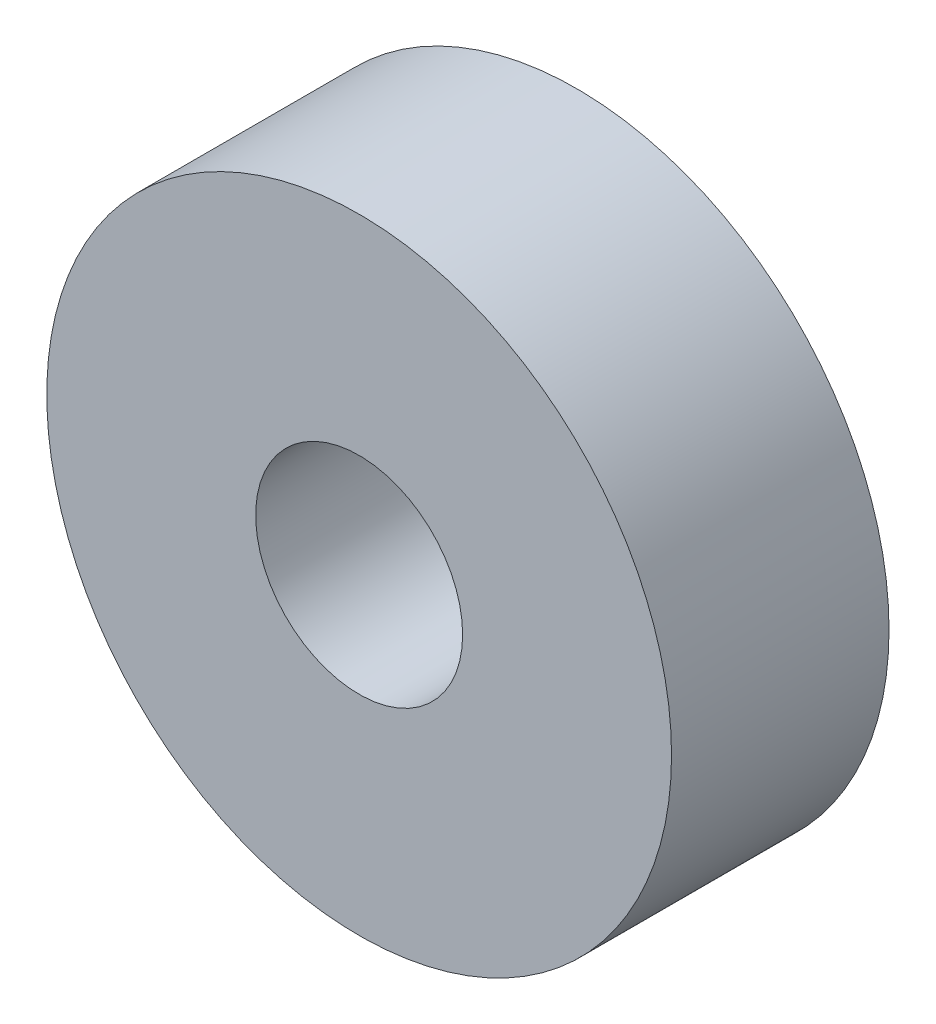
ISO-10303-21;
HEADER;
FILE_DESCRIPTION(('STEP AP214'),'2;1');
FILE_NAME('part.step','',(''),(''),'','','');
FILE_SCHEMA(('AUTOMOTIVE_DESIGN { 1 0 10303 214 1 1 1 1 }'));
ENDSEC;
DATA;
#1=APPLICATION_CONTEXT('core data for automotive mechanical design processes');
#2=APPLICATION_PROTOCOL_DEFINITION('international standard','automotive_design',2000,#1);
#3=PRODUCT_CONTEXT('',#1,'mechanical');
#4=PRODUCT('Part','Part','',(#3));
#5=PRODUCT_RELATED_PRODUCT_CATEGORY('part','',(#4));
#6=PRODUCT_DEFINITION_FORMATION('','',#4);
#7=PRODUCT_DEFINITION_CONTEXT('part definition',#1,'design');
#8=PRODUCT_DEFINITION('design','',#6,#7);
#9=PRODUCT_DEFINITION_SHAPE('','',#8);
#10=(LENGTH_UNIT() NAMED_UNIT(*) SI_UNIT(.MILLI.,.METRE.));
#11=(NAMED_UNIT(*) PLANE_ANGLE_UNIT() SI_UNIT($,.RADIAN.));
#12=(NAMED_UNIT(*) SI_UNIT($,.STERADIAN.) SOLID_ANGLE_UNIT());
#13=UNCERTAINTY_MEASURE_WITH_UNIT(LENGTH_MEASURE(1.E-05),#10,'distance_accuracy_value','');
#14=(GEOMETRIC_REPRESENTATION_CONTEXT(3) GLOBAL_UNCERTAINTY_ASSIGNED_CONTEXT((#13)) GLOBAL_UNIT_ASSIGNED_CONTEXT((#10,
#11,#12)) REPRESENTATION_CONTEXT('',''));
#15=CARTESIAN_POINT('',(0.,0.,0.));
#16=DIRECTION('',(0.,0.,1.));
#17=DIRECTION('',(1.,0.,0.));
#18=AXIS2_PLACEMENT_3D('',#15,#16,#17);
#19=CARTESIAN_POINT('',(0.,0.,9.9568));
#20=DIRECTION('',(0.,0.,1.));
#21=DIRECTION('',(1.,0.,0.));
#22=AXIS2_PLACEMENT_3D('',#19,#20,#21);
#23=PLANE('',#22);
#24=CARTESIAN_POINT('',(0.,0.,9.9568));
#25=DIRECTION('',(0.,0.,1.));
#26=DIRECTION('',(1.,0.,0.));
#27=AXIS2_PLACEMENT_3D('',#24,#25,#26);
#28=CIRCLE('',#27,14.3002);
#29=CARTESIAN_POINT('',(14.3002,0.,9.9568));
#30=VERTEX_POINT('',#29);
#31=EDGE_CURVE('E10',#30,#30,#28,.T.);
#32=ORIENTED_EDGE('',*,*,#31,.T.);
#33=EDGE_LOOP('',(#32));
#34=FACE_BOUND('',#33,.T.);
#35=CARTESIAN_POINT('',(0.,0.,9.9568));
#36=DIRECTION('',(0.,0.,1.));
#37=DIRECTION('',(1.,0.,0.));
#38=AXIS2_PLACEMENT_3D('',#35,#36,#37);
#39=CIRCLE('',#38,4.7371);
#40=CARTESIAN_POINT('',(4.7371,0.,9.9568));
#41=VERTEX_POINT('',#40);
#42=EDGE_CURVE('E41',#41,#41,#39,.T.);
#43=ORIENTED_EDGE('',*,*,#42,.F.);
#44=EDGE_LOOP('',(#43));
#45=FACE_BOUND('',#44,.T.);
#46=ADVANCED_FACE('F30',(#34,#45),#23,.T.);
#47=CARTESIAN_POINT('',(0.,0.,0.));
#48=DIRECTION('',(0.,0.,1.));
#49=DIRECTION('',(1.,0.,0.));
#50=AXIS2_PLACEMENT_3D('',#47,#48,#49);
#51=PLANE('',#50);
#52=CARTESIAN_POINT('',(0.,0.,0.));
#53=DIRECTION('',(0.,0.,1.));
#54=DIRECTION('',(1.,0.,0.));
#55=AXIS2_PLACEMENT_3D('',#52,#53,#54);
#56=CIRCLE('',#55,14.3002);
#57=CARTESIAN_POINT('',(14.3002,0.,0.));
#58=VERTEX_POINT('',#57);
#59=EDGE_CURVE('E34',#58,#58,#56,.T.);
#60=ORIENTED_EDGE('',*,*,#59,.F.);
#61=EDGE_LOOP('',(#60));
#62=FACE_BOUND('',#61,.T.);
#63=CARTESIAN_POINT('',(0.,0.,0.));
#64=DIRECTION('',(0.,0.,1.));
#65=DIRECTION('',(1.,0.,0.));
#66=AXIS2_PLACEMENT_3D('',#63,#64,#65);
#67=CIRCLE('',#66,4.7371);
#68=CARTESIAN_POINT('',(4.7371,0.,0.));
#69=VERTEX_POINT('',#68);
#70=EDGE_CURVE('E43',#69,#69,#67,.T.);
#71=ORIENTED_EDGE('',*,*,#70,.T.);
#72=EDGE_LOOP('',(#71));
#73=FACE_BOUND('',#72,.T.);
#74=ADVANCED_FACE('F53',(#62,#73),#51,.F.);
#75=CARTESIAN_POINT('',(0.,0.,9.9568));
#76=DIRECTION('',(0.,0.,-1.));
#77=DIRECTION('',(-1.,0.,0.));
#78=AXIS2_PLACEMENT_3D('',#75,#76,#77);
#79=CYLINDRICAL_SURFACE('',#78,14.3002);
#80=ORIENTED_EDGE('',*,*,#31,.F.);
#81=EDGE_LOOP('',(#80));
#82=FACE_BOUND('',#81,.T.);
#83=ORIENTED_EDGE('',*,*,#59,.T.);
#84=EDGE_LOOP('',(#83));
#85=FACE_BOUND('',#84,.T.);
#86=ADVANCED_FACE('F32',(#82,#85),#79,.T.);
#87=CARTESIAN_POINT('',(0.,0.,9.9568));
#88=DIRECTION('',(0.,0.,-1.));
#89=DIRECTION('',(-1.,0.,0.));
#90=AXIS2_PLACEMENT_3D('',#87,#88,#89);
#91=CYLINDRICAL_SURFACE('',#90,4.7371);
#92=ORIENTED_EDGE('',*,*,#42,.T.);
#93=EDGE_LOOP('',(#92));
#94=FACE_BOUND('',#93,.T.);
#95=ORIENTED_EDGE('',*,*,#70,.F.);
#96=EDGE_LOOP('',(#95));
#97=FACE_BOUND('',#96,.T.);
#98=ADVANCED_FACE('F49',(#94,#97),#91,.F.);
#99=CLOSED_SHELL('',(#46,#74,#86,#98));
#100=MANIFOLD_SOLID_BREP('B2',#99);
#101=ADVANCED_BREP_SHAPE_REPRESENTATION('',(#18,#100),#14);
#102=SHAPE_DEFINITION_REPRESENTATION(#9,#101);
ENDSEC;
END-ISO-10303-21;
